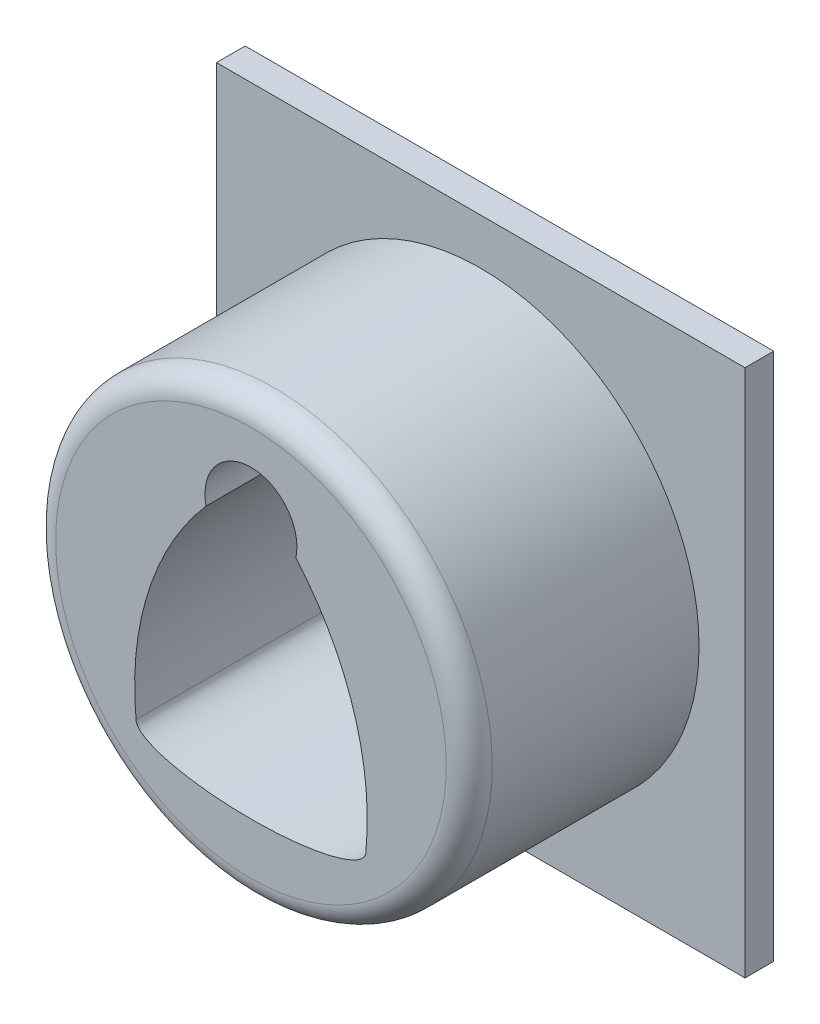
ISO-10303-21;
HEADER;
FILE_DESCRIPTION(('STEP AP214'),'2;1');
FILE_NAME('part.step','',(''),(''),'','','');
FILE_SCHEMA(('AUTOMOTIVE_DESIGN { 1 0 10303 214 1 1 1 1 }'));
ENDSEC;
DATA;
#1=APPLICATION_CONTEXT('core data for automotive mechanical design processes');
#2=APPLICATION_PROTOCOL_DEFINITION('international standard','automotive_design',2000,#1);
#3=PRODUCT_CONTEXT('',#1,'mechanical');
#4=PRODUCT('Part','Part','',(#3));
#5=PRODUCT_RELATED_PRODUCT_CATEGORY('part','',(#4));
#6=PRODUCT_DEFINITION_FORMATION('','',#4);
#7=PRODUCT_DEFINITION_CONTEXT('part definition',#1,'design');
#8=PRODUCT_DEFINITION('design','',#6,#7);
#9=PRODUCT_DEFINITION_SHAPE('','',#8);
#10=(LENGTH_UNIT() NAMED_UNIT(*) SI_UNIT(.MILLI.,.METRE.));
#11=(NAMED_UNIT(*) PLANE_ANGLE_UNIT() SI_UNIT($,.RADIAN.));
#12=(NAMED_UNIT(*) SI_UNIT($,.STERADIAN.) SOLID_ANGLE_UNIT());
#13=UNCERTAINTY_MEASURE_WITH_UNIT(LENGTH_MEASURE(1.E-05),#10,'distance_accuracy_value','');
#14=(GEOMETRIC_REPRESENTATION_CONTEXT(3) GLOBAL_UNCERTAINTY_ASSIGNED_CONTEXT((#13)) GLOBAL_UNIT_ASSIGNED_CONTEXT((#10,
#11,#12)) REPRESENTATION_CONTEXT('',''));
#15=CARTESIAN_POINT('',(0.,0.,0.));
#16=DIRECTION('',(0.,0.,1.));
#17=DIRECTION('',(1.,0.,0.));
#18=AXIS2_PLACEMENT_3D('',#15,#16,#17);
#19=CARTESIAN_POINT('',(0.,0.,4.));
#20=DIRECTION('',(0.,0.,1.));
#21=DIRECTION('',(1.,0.,0.));
#22=AXIS2_PLACEMENT_3D('',#19,#20,#21);
#23=PLANE('',#22);
#24=CARTESIAN_POINT('',(0.,0.,4.));
#25=DIRECTION('',(0.,0.,1.));
#26=DIRECTION('',(1.,0.,0.));
#27=AXIS2_PLACEMENT_3D('',#24,#25,#26);
#28=CIRCLE('',#27,3.4);
#29=CARTESIAN_POINT('',(3.4,0.,4.));
#30=VERTEX_POINT('',#29);
#31=EDGE_CURVE('E44',#30,#30,#28,.T.);
#32=ORIENTED_EDGE('',*,*,#31,.T.);
#33=EDGE_LOOP('',(#32));
#34=FACE_BOUND('',#33,.T.);
#35=CARTESIAN_POINT('',(0.,-2.00378215413677,4.));
#36=DIRECTION('',(0.,0.,1.));
#37=DIRECTION('',(1.,0.,0.));
#38=AXIS2_PLACEMENT_3D('',#35,#36,#37);
#39=ELLIPSE('',#38,2.,0.5);
#40=CARTESIAN_POINT('',(-2.,-2.00378215413677,4.));
#41=VERTEX_POINT('',#40);
#42=CARTESIAN_POINT('',(2.,-2.00378215413677,4.));
#43=VERTEX_POINT('',#42);
#44=EDGE_CURVE('E218',#41,#43,#39,.T.);
#45=ORIENTED_EDGE('',*,*,#44,.F.);
#46=CARTESIAN_POINT('',(3.0493670216784,-1.50378215413677,4.));
#47=DIRECTION('',(0.,0.,1.));
#48=DIRECTION('',(1.,0.,0.));
#49=AXIS2_PLACEMENT_3D('',#46,#47,#48);
#50=CIRCLE('',#49,5.07406221085368);
#51=CARTESIAN_POINT('',(-0.78053041808185,1.82457974333341,4.));
#52=VERTEX_POINT('',#51);
#53=EDGE_CURVE('E51',#41,#52,#50,.F.);
#54=ORIENTED_EDGE('',*,*,#53,.T.);
#55=CARTESIAN_POINT('',(0.,2.,4.));
#56=DIRECTION('',(0.,0.,1.));
#57=DIRECTION('',(1.,0.,0.));
#58=AXIS2_PLACEMENT_3D('',#55,#56,#57);
#59=CIRCLE('',#58,0.8);
#60=CARTESIAN_POINT('',(0.780530418081858,1.82457974333345,4.));
#61=VERTEX_POINT('',#60);
#62=EDGE_CURVE('E127',#61,#52,#59,.T.);
#63=ORIENTED_EDGE('',*,*,#62,.F.);
#64=CARTESIAN_POINT('',(-3.04936702167842,-1.50378215413673,4.));
#65=DIRECTION('',(0.,0.,1.));
#66=DIRECTION('',(1.,0.,0.));
#67=AXIS2_PLACEMENT_3D('',#64,#65,#66);
#68=CIRCLE('',#67,5.0740622108537);
#69=EDGE_CURVE('E215',#43,#61,#68,.T.);
#70=ORIENTED_EDGE('',*,*,#69,.F.);
#71=EDGE_LOOP('',(#45,#54,#63,#70));
#72=FACE_BOUND('',#71,.T.);
#73=ADVANCED_FACE('F36',(#34,#72),#23,.T.);
#74=CARTESIAN_POINT('',(0.,0.,4.));
#75=DIRECTION('',(0.,0.,-1.));
#76=DIRECTION('',(-1.,0.,0.));
#77=AXIS2_PLACEMENT_3D('',#74,#75,#76);
#78=CYLINDRICAL_SURFACE('',#77,3.8);
#79=CARTESIAN_POINT('',(0.,0.,3.6));
#80=DIRECTION('',(0.,0.,1.));
#81=DIRECTION('',(1.,0.,0.));
#82=AXIS2_PLACEMENT_3D('',#79,#80,#81);
#83=CIRCLE('',#82,3.8);
#84=CARTESIAN_POINT('',(3.8,0.,3.6));
#85=VERTEX_POINT('',#84);
#86=EDGE_CURVE('E11',#85,#85,#83,.F.);
#87=ORIENTED_EDGE('',*,*,#86,.T.);
#88=EDGE_LOOP('',(#87));
#89=FACE_BOUND('',#88,.T.);
#90=CARTESIAN_POINT('',(0.,0.,0.));
#91=DIRECTION('',(0.,0.,1.));
#92=DIRECTION('',(1.,0.,0.));
#93=AXIS2_PLACEMENT_3D('',#90,#91,#92);
#94=CIRCLE('',#93,3.8);
#95=CARTESIAN_POINT('',(3.8,0.,0.));
#96=VERTEX_POINT('',#95);
#97=EDGE_CURVE('E181',#96,#96,#94,.T.);
#98=ORIENTED_EDGE('',*,*,#97,.T.);
#99=EDGE_LOOP('',(#98));
#100=FACE_BOUND('',#99,.T.);
#101=ADVANCED_FACE('F167',(#89,#100),#78,.T.);
#102=CARTESIAN_POINT('',(4.6,4.6,-0.5));
#103=DIRECTION('',(-1.,0.,0.));
#104=DIRECTION('',(0.,-1.,0.));
#105=AXIS2_PLACEMENT_3D('',#102,#103,#104);
#106=PLANE('',#105);
#107=DIRECTION('',(0.,-1.,0.));
#108=VECTOR('',#107,1.);
#109=CARTESIAN_POINT('',(4.6,4.6,0.));
#110=LINE('',#109,#108);
#111=CARTESIAN_POINT('',(4.6,4.6,0.));
#112=VERTEX_POINT('',#111);
#113=CARTESIAN_POINT('',(4.6,-4.6,0.));
#114=VERTEX_POINT('',#113);
#115=EDGE_CURVE('E200',#112,#114,#110,.T.);
#116=ORIENTED_EDGE('',*,*,#115,.T.);
#117=DIRECTION('',(0.,0.,1.));
#118=VECTOR('',#117,1.);
#119=CARTESIAN_POINT('',(4.6,-4.6,-0.5));
#120=LINE('',#119,#118);
#121=CARTESIAN_POINT('',(4.6,-4.6,-0.5));
#122=VERTEX_POINT('',#121);
#123=EDGE_CURVE('E182',#122,#114,#120,.T.);
#124=ORIENTED_EDGE('',*,*,#123,.F.);
#125=DIRECTION('',(0.,-1.,0.));
#126=VECTOR('',#125,1.);
#127=CARTESIAN_POINT('',(4.6,4.6,-0.5));
#128=LINE('',#127,#126);
#129=CARTESIAN_POINT('',(4.6,4.6,-0.5));
#130=VERTEX_POINT('',#129);
#131=EDGE_CURVE('E195',#130,#122,#128,.T.);
#132=ORIENTED_EDGE('',*,*,#131,.F.);
#133=DIRECTION('',(0.,0.,1.));
#134=VECTOR('',#133,1.);
#135=CARTESIAN_POINT('',(4.6,4.6,-0.5));
#136=LINE('',#135,#134);
#137=EDGE_CURVE('E192',#130,#112,#136,.T.);
#138=ORIENTED_EDGE('',*,*,#137,.T.);
#139=EDGE_LOOP('',(#116,#124,#132,#138));
#140=FACE_BOUND('',#139,.T.);
#141=ADVANCED_FACE('F164',(#140),#106,.F.);
#142=CARTESIAN_POINT('',(4.6,-4.6,-0.5));
#143=DIRECTION('',(0.,1.,0.));
#144=DIRECTION('',(0.,0.,1.));
#145=AXIS2_PLACEMENT_3D('',#142,#143,#144);
#146=PLANE('',#145);
#147=DIRECTION('',(-1.,0.,0.));
#148=VECTOR('',#147,1.);
#149=CARTESIAN_POINT('',(4.6,-4.6,0.));
#150=LINE('',#149,#148);
#151=CARTESIAN_POINT('',(-4.6,-4.6,0.));
#152=VERTEX_POINT('',#151);
#153=EDGE_CURVE('E198',#114,#152,#150,.T.);
#154=ORIENTED_EDGE('',*,*,#153,.T.);
#155=DIRECTION('',(0.,0.,1.));
#156=VECTOR('',#155,1.);
#157=CARTESIAN_POINT('',(-4.6,-4.6,-0.5));
#158=LINE('',#157,#156);
#159=CARTESIAN_POINT('',(-4.6,-4.6,-0.5));
#160=VERTEX_POINT('',#159);
#161=EDGE_CURVE('E185',#160,#152,#158,.T.);
#162=ORIENTED_EDGE('',*,*,#161,.F.);
#163=DIRECTION('',(-1.,0.,0.));
#164=VECTOR('',#163,1.);
#165=CARTESIAN_POINT('',(4.6,-4.6,-0.5));
#166=LINE('',#165,#164);
#167=EDGE_CURVE('E89',#122,#160,#166,.T.);
#168=ORIENTED_EDGE('',*,*,#167,.F.);
#169=ORIENTED_EDGE('',*,*,#123,.T.);
#170=EDGE_LOOP('',(#154,#162,#168,#169));
#171=FACE_BOUND('',#170,.T.);
#172=ADVANCED_FACE('F160',(#171),#146,.F.);
#173=CARTESIAN_POINT('',(-4.6,4.6,-0.5));
#174=DIRECTION('',(1.,0.,0.));
#175=DIRECTION('',(0.,1.,0.));
#176=AXIS2_PLACEMENT_3D('',#173,#174,#175);
#177=PLANE('',#176);
#178=DIRECTION('',(0.,1.,0.));
#179=VECTOR('',#178,1.);
#180=CARTESIAN_POINT('',(-4.6,4.6,0.));
#181=LINE('',#180,#179);
#182=CARTESIAN_POINT('',(-4.6,4.6,0.));
#183=VERTEX_POINT('',#182);
#184=EDGE_CURVE('E196',#152,#183,#181,.T.);
#185=ORIENTED_EDGE('',*,*,#184,.T.);
#186=DIRECTION('',(0.,0.,1.));
#187=VECTOR('',#186,1.);
#188=CARTESIAN_POINT('',(-4.6,4.6,-0.5));
#189=LINE('',#188,#187);
#190=CARTESIAN_POINT('',(-4.6,4.6,-0.5));
#191=VERTEX_POINT('',#190);
#192=EDGE_CURVE('E190',#191,#183,#189,.T.);
#193=ORIENTED_EDGE('',*,*,#192,.F.);
#194=DIRECTION('',(0.,1.,0.));
#195=VECTOR('',#194,1.);
#196=CARTESIAN_POINT('',(-4.6,4.6,-0.5));
#197=LINE('',#196,#195);
#198=EDGE_CURVE('E205',#160,#191,#197,.T.);
#199=ORIENTED_EDGE('',*,*,#198,.F.);
#200=ORIENTED_EDGE('',*,*,#161,.T.);
#201=EDGE_LOOP('',(#185,#193,#199,#200));
#202=FACE_BOUND('',#201,.T.);
#203=ADVANCED_FACE('F157',(#202),#177,.F.);
#204=CARTESIAN_POINT('',(4.6,4.6,-0.5));
#205=DIRECTION('',(0.,-1.,0.));
#206=DIRECTION('',(0.,0.,-1.));
#207=AXIS2_PLACEMENT_3D('',#204,#205,#206);
#208=PLANE('',#207);
#209=DIRECTION('',(1.,0.,0.));
#210=VECTOR('',#209,1.);
#211=CARTESIAN_POINT('',(4.6,4.6,0.));
#212=LINE('',#211,#210);
#213=EDGE_CURVE('E81',#183,#112,#212,.T.);
#214=ORIENTED_EDGE('',*,*,#213,.T.);
#215=ORIENTED_EDGE('',*,*,#137,.F.);
#216=DIRECTION('',(1.,0.,0.));
#217=VECTOR('',#216,1.);
#218=CARTESIAN_POINT('',(4.6,4.6,-0.5));
#219=LINE('',#218,#217);
#220=EDGE_CURVE('E60',#191,#130,#219,.T.);
#221=ORIENTED_EDGE('',*,*,#220,.F.);
#222=ORIENTED_EDGE('',*,*,#192,.T.);
#223=EDGE_LOOP('',(#214,#215,#221,#222));
#224=FACE_BOUND('',#223,.T.);
#225=ADVANCED_FACE('F150',(#224),#208,.F.);
#226=CARTESIAN_POINT('',(0.,0.,-0.5));
#227=DIRECTION('',(0.,0.,-1.));
#228=DIRECTION('',(-1.,0.,0.));
#229=AXIS2_PLACEMENT_3D('',#226,#227,#228);
#230=PLANE('',#229);
#231=CARTESIAN_POINT('',(0.,0.,-0.5));
#232=DIRECTION('',(0.,0.,1.));
#233=DIRECTION('',(1.,0.,0.));
#234=AXIS2_PLACEMENT_3D('',#231,#232,#233);
#235=CIRCLE('',#234,0.6);
#236=CARTESIAN_POINT('',(0.6,0.,-0.5));
#237=VERTEX_POINT('',#236);
#238=EDGE_CURVE('E220',#237,#237,#235,.T.);
#239=ORIENTED_EDGE('',*,*,#238,.T.);
#240=EDGE_LOOP('',(#239));
#241=FACE_BOUND('',#240,.T.);
#242=ORIENTED_EDGE('',*,*,#131,.T.);
#243=ORIENTED_EDGE('',*,*,#167,.T.);
#244=ORIENTED_EDGE('',*,*,#198,.T.);
#245=ORIENTED_EDGE('',*,*,#220,.T.);
#246=EDGE_LOOP('',(#242,#243,#244,#245));
#247=FACE_BOUND('',#246,.T.);
#248=ADVANCED_FACE('F146',(#241,#247),#230,.T.);
#249=CARTESIAN_POINT('',(0.,0.,0.));
#250=DIRECTION('',(0.,0.,-1.));
#251=DIRECTION('',(-1.,0.,0.));
#252=AXIS2_PLACEMENT_3D('',#249,#250,#251);
#253=PLANE('',#252);
#254=ORIENTED_EDGE('',*,*,#97,.F.);
#255=EDGE_LOOP('',(#254));
#256=FACE_BOUND('',#255,.T.);
#257=ORIENTED_EDGE('',*,*,#115,.F.);
#258=ORIENTED_EDGE('',*,*,#213,.F.);
#259=ORIENTED_EDGE('',*,*,#184,.F.);
#260=ORIENTED_EDGE('',*,*,#153,.F.);
#261=EDGE_LOOP('',(#257,#258,#259,#260));
#262=FACE_BOUND('',#261,.T.);
#263=ADVANCED_FACE('F149',(#256,#262),#253,.F.);
#264=CARTESIAN_POINT('',(0.,0.,3.6));
#265=DIRECTION('',(0.,0.,1.));
#266=DIRECTION('',(1.,0.,0.));
#267=AXIS2_PLACEMENT_3D('',#264,#265,#266);
#268=TOROIDAL_SURFACE('',#267,3.4,0.4);
#269=ORIENTED_EDGE('',*,*,#86,.F.);
#270=EDGE_LOOP('',(#269));
#271=FACE_BOUND('',#270,.T.);
#272=ORIENTED_EDGE('',*,*,#31,.F.);
#273=EDGE_LOOP('',(#272));
#274=FACE_BOUND('',#273,.T.);
#275=ADVANCED_FACE('F38',(#271,#274),#268,.T.);
#276=CARTESIAN_POINT('',(3.0493670216784,-1.50378215413677,0.));
#277=DIRECTION('',(0.,0.,1.));
#278=DIRECTION('',(1.,0.,0.));
#279=AXIS2_PLACEMENT_3D('',#276,#277,#278);
#280=CYLINDRICAL_SURFACE('',#279,5.07406221085368);
#281=ORIENTED_EDGE('',*,*,#53,.F.);
#282=DIRECTION('',(0.,0.,1.));
#283=VECTOR('',#282,1.);
#284=CARTESIAN_POINT('',(-2.,-2.00378215413677,0.));
#285=LINE('',#284,#283);
#286=CARTESIAN_POINT('',(-2.,-2.00378215413677,0.));
#287=VERTEX_POINT('',#286);
#288=EDGE_CURVE('E108',#287,#41,#285,.T.);
#289=ORIENTED_EDGE('',*,*,#288,.F.);
#290=CARTESIAN_POINT('',(3.0493670216784,-1.50378215413677,0.));
#291=DIRECTION('',(0.,0.,1.));
#292=DIRECTION('',(1.,0.,0.));
#293=AXIS2_PLACEMENT_3D('',#290,#291,#292);
#294=CIRCLE('',#293,5.07406221085368);
#295=CARTESIAN_POINT('',(-0.78053041808185,1.82457974333341,0.));
#296=VERTEX_POINT('',#295);
#297=EDGE_CURVE('E111',#287,#296,#294,.F.);
#298=ORIENTED_EDGE('',*,*,#297,.T.);
#299=DIRECTION('',(0.,0.,1.));
#300=VECTOR('',#299,1.);
#301=CARTESIAN_POINT('',(-0.78053041808185,1.82457974333341,0.));
#302=LINE('',#301,#300);
#303=EDGE_CURVE('E203',#296,#52,#302,.T.);
#304=ORIENTED_EDGE('',*,*,#303,.T.);
#305=EDGE_LOOP('',(#281,#289,#298,#304));
#306=FACE_BOUND('',#305,.T.);
#307=ADVANCED_FACE('F110',(#306),#280,.F.);
#308=CARTESIAN_POINT('',(0.,2.,0.));
#309=DIRECTION('',(0.,0.,1.));
#310=DIRECTION('',(1.,0.,0.));
#311=AXIS2_PLACEMENT_3D('',#308,#309,#310);
#312=CYLINDRICAL_SURFACE('',#311,0.8);
#313=ORIENTED_EDGE('',*,*,#62,.T.);
#314=ORIENTED_EDGE('',*,*,#303,.F.);
#315=CARTESIAN_POINT('',(0.,2.,0.));
#316=DIRECTION('',(0.,0.,1.));
#317=DIRECTION('',(1.,0.,0.));
#318=AXIS2_PLACEMENT_3D('',#315,#316,#317);
#319=CIRCLE('',#318,0.8);
#320=CARTESIAN_POINT('',(0.780530418081858,1.82457974333345,0.));
#321=VERTEX_POINT('',#320);
#322=EDGE_CURVE('E118',#321,#296,#319,.T.);
#323=ORIENTED_EDGE('',*,*,#322,.F.);
#324=DIRECTION('',(0.,0.,1.));
#325=VECTOR('',#324,1.);
#326=CARTESIAN_POINT('',(0.780530418081858,1.82457974333345,0.));
#327=LINE('',#326,#325);
#328=EDGE_CURVE('E210',#321,#61,#327,.T.);
#329=ORIENTED_EDGE('',*,*,#328,.T.);
#330=EDGE_LOOP('',(#313,#314,#323,#329));
#331=FACE_BOUND('',#330,.T.);
#332=ADVANCED_FACE('F145',(#331),#312,.F.);
#333=CARTESIAN_POINT('',(-3.04936702167842,-1.50378215413673,0.));
#334=DIRECTION('',(0.,0.,1.));
#335=DIRECTION('',(1.,0.,0.));
#336=AXIS2_PLACEMENT_3D('',#333,#334,#335);
#337=CYLINDRICAL_SURFACE('',#336,5.0740622108537);
#338=ORIENTED_EDGE('',*,*,#69,.T.);
#339=ORIENTED_EDGE('',*,*,#328,.F.);
#340=CARTESIAN_POINT('',(-3.04936702167842,-1.50378215413673,0.));
#341=DIRECTION('',(0.,0.,1.));
#342=DIRECTION('',(1.,0.,0.));
#343=AXIS2_PLACEMENT_3D('',#340,#341,#342);
#344=CIRCLE('',#343,5.0740622108537);
#345=CARTESIAN_POINT('',(2.,-2.00378215413677,0.));
#346=VERTEX_POINT('',#345);
#347=EDGE_CURVE('E131',#346,#321,#344,.T.);
#348=ORIENTED_EDGE('',*,*,#347,.F.);
#349=DIRECTION('',(0.,0.,1.));
#350=VECTOR('',#349,1.);
#351=CARTESIAN_POINT('',(2.,-2.00378215413677,0.));
#352=LINE('',#351,#350);
#353=EDGE_CURVE('E117',#346,#43,#352,.T.);
#354=ORIENTED_EDGE('',*,*,#353,.T.);
#355=EDGE_LOOP('',(#338,#339,#348,#354));
#356=FACE_BOUND('',#355,.T.);
#357=ADVANCED_FACE('F141',(#356),#337,.F.);
#358=CARTESIAN_POINT('',(0.,-2.00378215413677,0.));
#359=DIRECTION('',(0.,0.,1.));
#360=DIRECTION('',(1.,0.,0.));
#361=AXIS2_PLACEMENT_3D('',#358,#359,#360);
#362=ELLIPSE('',#361,2.,0.5);
#363=DIRECTION('',(0.,0.,1.));
#364=VECTOR('',#363,1.);
#365=SURFACE_OF_LINEAR_EXTRUSION('',#362,#364);
#366=ORIENTED_EDGE('',*,*,#44,.T.);
#367=ORIENTED_EDGE('',*,*,#353,.F.);
#368=EDGE_CURVE('E125',#287,#346,#362,.T.);
#369=ORIENTED_EDGE('',*,*,#368,.F.);
#370=ORIENTED_EDGE('',*,*,#288,.T.);
#371=EDGE_LOOP('',(#366,#367,#369,#370));
#372=FACE_BOUND('',#371,.T.);
#373=ADVANCED_FACE('F129',(#372),#365,.F.);
#374=CARTESIAN_POINT('',(0.,0.,0.));
#375=DIRECTION('',(0.,0.,1.));
#376=DIRECTION('',(1.,0.,0.));
#377=AXIS2_PLACEMENT_3D('',#374,#375,#376);
#378=PLANE('',#377);
#379=CARTESIAN_POINT('',(0.,0.,0.));
#380=DIRECTION('',(0.,0.,1.));
#381=DIRECTION('',(1.,0.,0.));
#382=AXIS2_PLACEMENT_3D('',#379,#380,#381);
#383=CIRCLE('',#382,0.6);
#384=CARTESIAN_POINT('',(0.6,0.,0.));
#385=VERTEX_POINT('',#384);
#386=EDGE_CURVE('E224',#385,#385,#383,.T.);
#387=ORIENTED_EDGE('',*,*,#386,.F.);
#388=EDGE_LOOP('',(#387));
#389=FACE_BOUND('',#388,.T.);
#390=ORIENTED_EDGE('',*,*,#297,.F.);
#391=ORIENTED_EDGE('',*,*,#368,.T.);
#392=ORIENTED_EDGE('',*,*,#347,.T.);
#393=ORIENTED_EDGE('',*,*,#322,.T.);
#394=EDGE_LOOP('',(#390,#391,#392,#393));
#395=FACE_BOUND('',#394,.T.);
#396=ADVANCED_FACE('F123',(#389,#395),#378,.T.);
#397=CARTESIAN_POINT('',(0.,0.,-0.5));
#398=DIRECTION('',(0.,0.,1.));
#399=DIRECTION('',(1.,0.,0.));
#400=AXIS2_PLACEMENT_3D('',#397,#398,#399);
#401=CYLINDRICAL_SURFACE('',#400,0.6);
#402=ORIENTED_EDGE('',*,*,#238,.F.);
#403=EDGE_LOOP('',(#402));
#404=FACE_BOUND('',#403,.T.);
#405=ORIENTED_EDGE('',*,*,#386,.T.);
#406=EDGE_LOOP('',(#405));
#407=FACE_BOUND('',#406,.T.);
#408=ADVANCED_FACE('F230',(#404,#407),#401,.F.);
#409=CLOSED_SHELL('',(#73,#101,#141,#172,#203,#225,#248,#263,#275,#307,#332,#357,#373,#396,#408));
#410=MANIFOLD_SOLID_BREP('B2',#409);
#411=ADVANCED_BREP_SHAPE_REPRESENTATION('',(#18,#410),#14);
#412=SHAPE_DEFINITION_REPRESENTATION(#9,#411);
ENDSEC;
END-ISO-10303-21;
